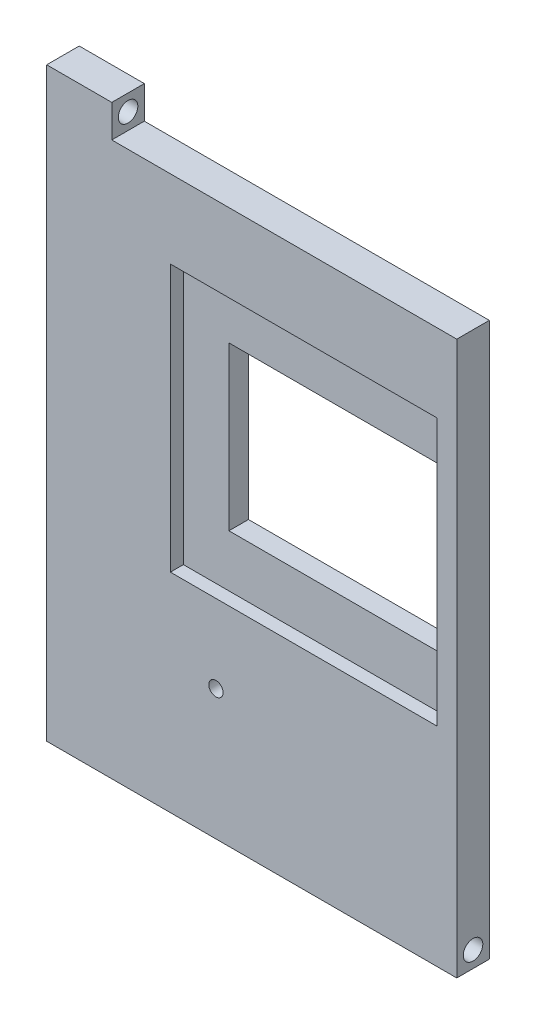
ISO-10303-21;
HEADER;
FILE_DESCRIPTION(('STEP AP214'),'2;1');
FILE_NAME('part.step','',(''),(''),'','','');
FILE_SCHEMA(('AUTOMOTIVE_DESIGN { 1 0 10303 214 1 1 1 1 }'));
ENDSEC;
DATA;
#1=APPLICATION_CONTEXT('core data for automotive mechanical design processes');
#2=APPLICATION_PROTOCOL_DEFINITION('international standard','automotive_design',2000,#1);
#3=PRODUCT_CONTEXT('',#1,'mechanical');
#4=PRODUCT('Part','Part','',(#3));
#5=PRODUCT_RELATED_PRODUCT_CATEGORY('part','',(#4));
#6=PRODUCT_DEFINITION_FORMATION('','',#4);
#7=PRODUCT_DEFINITION_CONTEXT('part definition',#1,'design');
#8=PRODUCT_DEFINITION('design','',#6,#7);
#9=PRODUCT_DEFINITION_SHAPE('','',#8);
#10=(LENGTH_UNIT() NAMED_UNIT(*) SI_UNIT(.MILLI.,.METRE.));
#11=(NAMED_UNIT(*) PLANE_ANGLE_UNIT() SI_UNIT($,.RADIAN.));
#12=(NAMED_UNIT(*) SI_UNIT($,.STERADIAN.) SOLID_ANGLE_UNIT());
#13=UNCERTAINTY_MEASURE_WITH_UNIT(LENGTH_MEASURE(1.E-05),#10,'distance_accuracy_value','');
#14=(GEOMETRIC_REPRESENTATION_CONTEXT(3) GLOBAL_UNCERTAINTY_ASSIGNED_CONTEXT((#13)) GLOBAL_UNIT_ASSIGNED_CONTEXT((#10,
#11,#12)) REPRESENTATION_CONTEXT('',''));
#15=CARTESIAN_POINT('',(0.,0.,0.));
#16=DIRECTION('',(0.,0.,1.));
#17=DIRECTION('',(1.,0.,0.));
#18=AXIS2_PLACEMENT_3D('',#15,#16,#17);
#19=CARTESIAN_POINT('',(0.,0.,5.));
#20=DIRECTION('',(0.,0.,-1.));
#21=DIRECTION('',(-1.,0.,0.));
#22=AXIS2_PLACEMENT_3D('',#19,#20,#21);
#23=PLANE('',#22);
#24=CARTESIAN_POINT('',(26.,20.,5.));
#25=DIRECTION('',(0.,0.,-1.));
#26=DIRECTION('',(-1.,0.,0.));
#27=AXIS2_PLACEMENT_3D('',#24,#25,#26);
#28=CIRCLE('',#27,1.1);
#29=CARTESIAN_POINT('',(24.9,20.,5.));
#30=VERTEX_POINT('',#29);
#31=EDGE_CURVE('E342',#30,#30,#28,.F.);
#32=ORIENTED_EDGE('',*,*,#31,.F.);
#33=EDGE_LOOP('',(#32));
#34=FACE_BOUND('',#33,.T.);
#35=DIRECTION('',(0.,-1.,0.));
#36=VECTOR('',#35,1.);
#37=CARTESIAN_POINT('',(0.,90.,5.));
#38=LINE('',#37,#36);
#39=CARTESIAN_POINT('',(0.,90.,5.));
#40=VERTEX_POINT('',#39);
#41=CARTESIAN_POINT('',(0.,0.,5.));
#42=VERTEX_POINT('',#41);
#43=EDGE_CURVE('E185',#40,#42,#38,.T.);
#44=ORIENTED_EDGE('',*,*,#43,.T.);
#45=DIRECTION('',(1.,0.,0.));
#46=VECTOR('',#45,1.);
#47=CARTESIAN_POINT('',(63.,0.,5.));
#48=LINE('',#47,#46);
#49=CARTESIAN_POINT('',(63.,0.,5.));
#50=VERTEX_POINT('',#49);
#51=EDGE_CURVE('E187',#42,#50,#48,.T.);
#52=ORIENTED_EDGE('',*,*,#51,.T.);
#53=DIRECTION('',(0.,1.,0.));
#54=VECTOR('',#53,1.);
#55=CARTESIAN_POINT('',(63.,0.,5.));
#56=LINE('',#55,#54);
#57=CARTESIAN_POINT('',(63.,85.,5.));
#58=VERTEX_POINT('',#57);
#59=EDGE_CURVE('E190',#50,#58,#56,.T.);
#60=ORIENTED_EDGE('',*,*,#59,.T.);
#61=DIRECTION('',(-1.,0.,0.));
#62=VECTOR('',#61,1.);
#63=CARTESIAN_POINT('',(63.,85.,5.));
#64=LINE('',#63,#62);
#65=CARTESIAN_POINT('',(9.99999999999999,85.,5.));
#66=VERTEX_POINT('',#65);
#67=EDGE_CURVE('E192',#58,#66,#64,.T.);
#68=ORIENTED_EDGE('',*,*,#67,.T.);
#69=DIRECTION('',(0.,1.,0.));
#70=VECTOR('',#69,1.);
#71=CARTESIAN_POINT('',(9.99999999999999,85.,5.));
#72=LINE('',#71,#70);
#73=CARTESIAN_POINT('',(9.99999999999999,90.,5.));
#74=VERTEX_POINT('',#73);
#75=EDGE_CURVE('E194',#66,#74,#72,.T.);
#76=ORIENTED_EDGE('',*,*,#75,.T.);
#77=DIRECTION('',(-1.,0.,0.));
#78=VECTOR('',#77,1.);
#79=CARTESIAN_POINT('',(9.99999999999999,90.,5.));
#80=LINE('',#79,#78);
#81=EDGE_CURVE('E196',#74,#40,#80,.T.);
#82=ORIENTED_EDGE('',*,*,#81,.T.);
#83=EDGE_LOOP('',(#44,#52,#60,#68,#76,#82));
#84=FACE_BOUND('',#83,.T.);
#85=DIRECTION('',(0.,1.,0.));
#86=VECTOR('',#85,1.);
#87=CARTESIAN_POINT('',(60.,65.,5.));
#88=LINE('',#87,#86);
#89=CARTESIAN_POINT('',(60.,32.,5.));
#90=VERTEX_POINT('',#89);
#91=CARTESIAN_POINT('',(60.,73.,5.));
#92=VERTEX_POINT('',#91);
#93=EDGE_CURVE('E166',#90,#92,#88,.T.);
#94=ORIENTED_EDGE('',*,*,#93,.F.);
#95=DIRECTION('',(-1.,0.,0.));
#96=VECTOR('',#95,1.);
#97=CARTESIAN_POINT('',(0.,32.,5.));
#98=LINE('',#97,#96);
#99=CARTESIAN_POINT('',(19.,32.,5.));
#100=VERTEX_POINT('',#99);
#101=EDGE_CURVE('E154',#90,#100,#98,.T.);
#102=ORIENTED_EDGE('',*,*,#101,.T.);
#103=DIRECTION('',(0.,1.,0.));
#104=VECTOR('',#103,1.);
#105=CARTESIAN_POINT('',(19.,0.,5.));
#106=LINE('',#105,#104);
#107=CARTESIAN_POINT('',(19.,73.,5.));
#108=VERTEX_POINT('',#107);
#109=EDGE_CURVE('E363',#100,#108,#106,.T.);
#110=ORIENTED_EDGE('',*,*,#109,.T.);
#111=DIRECTION('',(1.,0.,0.));
#112=VECTOR('',#111,1.);
#113=CARTESIAN_POINT('',(0.,73.,5.));
#114=LINE('',#113,#112);
#115=EDGE_CURVE('E141',#108,#92,#114,.T.);
#116=ORIENTED_EDGE('',*,*,#115,.T.);
#117=EDGE_LOOP('',(#94,#102,#110,#116));
#118=FACE_BOUND('',#117,.T.);
#119=ADVANCED_FACE('F37',(#34,#84,#118),#23,.F.);
#120=CARTESIAN_POINT('',(0.,0.,5.));
#121=DIRECTION('',(1.,0.,0.));
#122=DIRECTION('',(0.,0.,-1.));
#123=AXIS2_PLACEMENT_3D('',#120,#121,#122);
#124=PLANE('',#123);
#125=CARTESIAN_POINT('',(0.,87.5,2.5));
#126=DIRECTION('',(-1.,0.,0.));
#127=DIRECTION('',(0.,0.,1.));
#128=AXIS2_PLACEMENT_3D('',#125,#126,#127);
#129=CIRCLE('',#128,1.5);
#130=CARTESIAN_POINT('',(0.,87.5,4.));
#131=VERTEX_POINT('',#130);
#132=EDGE_CURVE('E351',#131,#131,#129,.T.);
#133=ORIENTED_EDGE('',*,*,#132,.F.);
#134=EDGE_LOOP('',(#133));
#135=FACE_BOUND('',#134,.T.);
#136=DIRECTION('',(0.,-1.,0.));
#137=VECTOR('',#136,1.);
#138=CARTESIAN_POINT('',(0.,0.,0.));
#139=LINE('',#138,#137);
#140=CARTESIAN_POINT('',(0.,90.,0.));
#141=VERTEX_POINT('',#140);
#142=CARTESIAN_POINT('',(0.,0.,0.));
#143=VERTEX_POINT('',#142);
#144=EDGE_CURVE('E168',#141,#143,#139,.T.);
#145=ORIENTED_EDGE('',*,*,#144,.T.);
#146=DIRECTION('',(0.,0.,-1.));
#147=VECTOR('',#146,1.);
#148=CARTESIAN_POINT('',(0.,0.,5.));
#149=LINE('',#148,#147);
#150=EDGE_CURVE('E45',#42,#143,#149,.T.);
#151=ORIENTED_EDGE('',*,*,#150,.F.);
#152=ORIENTED_EDGE('',*,*,#43,.F.);
#153=DIRECTION('',(0.,0.,-1.));
#154=VECTOR('',#153,1.);
#155=CARTESIAN_POINT('',(0.,90.,5.));
#156=LINE('',#155,#154);
#157=EDGE_CURVE('E198',#40,#141,#156,.T.);
#158=ORIENTED_EDGE('',*,*,#157,.T.);
#159=EDGE_LOOP('',(#145,#151,#152,#158));
#160=FACE_BOUND('',#159,.T.);
#161=ADVANCED_FACE('F39',(#135,#160),#124,.F.);
#162=CARTESIAN_POINT('',(63.,0.,5.));
#163=DIRECTION('',(0.,1.,0.));
#164=DIRECTION('',(-1.,0.,0.));
#165=AXIS2_PLACEMENT_3D('',#162,#163,#164);
#166=PLANE('',#165);
#167=DIRECTION('',(1.,0.,0.));
#168=VECTOR('',#167,1.);
#169=CARTESIAN_POINT('',(63.,0.,0.));
#170=LINE('',#169,#168);
#171=CARTESIAN_POINT('',(63.,0.,0.));
#172=VERTEX_POINT('',#171);
#173=EDGE_CURVE('E200',#143,#172,#170,.T.);
#174=ORIENTED_EDGE('',*,*,#173,.T.);
#175=DIRECTION('',(0.,0.,-1.));
#176=VECTOR('',#175,1.);
#177=CARTESIAN_POINT('',(63.,0.,5.));
#178=LINE('',#177,#176);
#179=EDGE_CURVE('E221',#50,#172,#178,.T.);
#180=ORIENTED_EDGE('',*,*,#179,.F.);
#181=ORIENTED_EDGE('',*,*,#51,.F.);
#182=ORIENTED_EDGE('',*,*,#150,.T.);
#183=EDGE_LOOP('',(#174,#180,#181,#182));
#184=FACE_BOUND('',#183,.T.);
#185=ADVANCED_FACE('F228',(#184),#166,.F.);
#186=CARTESIAN_POINT('',(63.,0.,5.));
#187=DIRECTION('',(-1.,0.,0.));
#188=DIRECTION('',(0.,-1.,0.));
#189=AXIS2_PLACEMENT_3D('',#186,#187,#188);
#190=PLANE('',#189);
#191=CARTESIAN_POINT('',(63.,2.50000000000001,2.5));
#192=DIRECTION('',(1.,0.,0.));
#193=DIRECTION('',(0.,0.,-1.));
#194=AXIS2_PLACEMENT_3D('',#191,#192,#193);
#195=CIRCLE('',#194,1.5);
#196=CARTESIAN_POINT('',(63.,2.50000000000001,1.));
#197=VERTEX_POINT('',#196);
#198=EDGE_CURVE('E343',#197,#197,#195,.T.);
#199=ORIENTED_EDGE('',*,*,#198,.F.);
#200=EDGE_LOOP('',(#199));
#201=FACE_BOUND('',#200,.T.);
#202=DIRECTION('',(0.,1.,0.));
#203=VECTOR('',#202,1.);
#204=CARTESIAN_POINT('',(63.,0.,0.));
#205=LINE('',#204,#203);
#206=CARTESIAN_POINT('',(63.,85.,0.));
#207=VERTEX_POINT('',#206);
#208=EDGE_CURVE('E202',#172,#207,#205,.T.);
#209=ORIENTED_EDGE('',*,*,#208,.T.);
#210=DIRECTION('',(0.,0.,-1.));
#211=VECTOR('',#210,1.);
#212=CARTESIAN_POINT('',(63.,85.,5.));
#213=LINE('',#212,#211);
#214=EDGE_CURVE('E218',#58,#207,#213,.T.);
#215=ORIENTED_EDGE('',*,*,#214,.F.);
#216=ORIENTED_EDGE('',*,*,#59,.F.);
#217=ORIENTED_EDGE('',*,*,#179,.T.);
#218=EDGE_LOOP('',(#209,#215,#216,#217));
#219=FACE_BOUND('',#218,.T.);
#220=ADVANCED_FACE('F240',(#201,#219),#190,.F.);
#221=CARTESIAN_POINT('',(63.,85.,5.));
#222=DIRECTION('',(0.,-1.,0.));
#223=DIRECTION('',(1.,0.,0.));
#224=AXIS2_PLACEMENT_3D('',#221,#222,#223);
#225=PLANE('',#224);
#226=DIRECTION('',(-1.,0.,0.));
#227=VECTOR('',#226,1.);
#228=CARTESIAN_POINT('',(63.,85.,0.));
#229=LINE('',#228,#227);
#230=CARTESIAN_POINT('',(9.99999999999999,85.,0.));
#231=VERTEX_POINT('',#230);
#232=EDGE_CURVE('E204',#207,#231,#229,.T.);
#233=ORIENTED_EDGE('',*,*,#232,.T.);
#234=DIRECTION('',(0.,0.,-1.));
#235=VECTOR('',#234,1.);
#236=CARTESIAN_POINT('',(9.99999999999999,85.,5.));
#237=LINE('',#236,#235);
#238=EDGE_CURVE('E215',#66,#231,#237,.T.);
#239=ORIENTED_EDGE('',*,*,#238,.F.);
#240=ORIENTED_EDGE('',*,*,#67,.F.);
#241=ORIENTED_EDGE('',*,*,#214,.T.);
#242=EDGE_LOOP('',(#233,#239,#240,#241));
#243=FACE_BOUND('',#242,.T.);
#244=ADVANCED_FACE('F244',(#243),#225,.F.);
#245=CARTESIAN_POINT('',(9.99999999999999,85.,5.));
#246=DIRECTION('',(-1.,0.,0.));
#247=DIRECTION('',(0.,0.,1.));
#248=AXIS2_PLACEMENT_3D('',#245,#246,#247);
#249=PLANE('',#248);
#250=CARTESIAN_POINT('',(9.99999999999999,87.5,2.5));
#251=DIRECTION('',(-1.,0.,0.));
#252=DIRECTION('',(0.,0.,1.));
#253=AXIS2_PLACEMENT_3D('',#250,#251,#252);
#254=CIRCLE('',#253,1.5);
#255=CARTESIAN_POINT('',(9.99999999999999,87.5,4.));
#256=VERTEX_POINT('',#255);
#257=EDGE_CURVE('E355',#256,#256,#254,.F.);
#258=ORIENTED_EDGE('',*,*,#257,.F.);
#259=EDGE_LOOP('',(#258));
#260=FACE_BOUND('',#259,.T.);
#261=DIRECTION('',(0.,1.,0.));
#262=VECTOR('',#261,1.);
#263=CARTESIAN_POINT('',(9.99999999999999,85.,0.));
#264=LINE('',#263,#262);
#265=CARTESIAN_POINT('',(9.99999999999999,90.,0.));
#266=VERTEX_POINT('',#265);
#267=EDGE_CURVE('E206',#231,#266,#264,.T.);
#268=ORIENTED_EDGE('',*,*,#267,.T.);
#269=DIRECTION('',(0.,0.,-1.));
#270=VECTOR('',#269,1.);
#271=CARTESIAN_POINT('',(9.99999999999999,90.,5.));
#272=LINE('',#271,#270);
#273=EDGE_CURVE('E212',#74,#266,#272,.T.);
#274=ORIENTED_EDGE('',*,*,#273,.F.);
#275=ORIENTED_EDGE('',*,*,#75,.F.);
#276=ORIENTED_EDGE('',*,*,#238,.T.);
#277=EDGE_LOOP('',(#268,#274,#275,#276));
#278=FACE_BOUND('',#277,.T.);
#279=ADVANCED_FACE('F255',(#260,#278),#249,.F.);
#280=CARTESIAN_POINT('',(9.99999999999999,90.,5.));
#281=DIRECTION('',(0.,-1.,0.));
#282=DIRECTION('',(0.,0.,-1.));
#283=AXIS2_PLACEMENT_3D('',#280,#281,#282);
#284=PLANE('',#283);
#285=DIRECTION('',(-1.,0.,0.));
#286=VECTOR('',#285,1.);
#287=CARTESIAN_POINT('',(9.99999999999999,90.,0.));
#288=LINE('',#287,#286);
#289=EDGE_CURVE('E188',#266,#141,#288,.T.);
#290=ORIENTED_EDGE('',*,*,#289,.T.);
#291=ORIENTED_EDGE('',*,*,#157,.F.);
#292=ORIENTED_EDGE('',*,*,#81,.F.);
#293=ORIENTED_EDGE('',*,*,#273,.T.);
#294=EDGE_LOOP('',(#290,#291,#292,#293));
#295=FACE_BOUND('',#294,.T.);
#296=ADVANCED_FACE('F253',(#295),#284,.F.);
#297=CARTESIAN_POINT('',(0.,0.,0.));
#298=DIRECTION('',(0.,0.,-1.));
#299=DIRECTION('',(-1.,0.,0.));
#300=AXIS2_PLACEMENT_3D('',#297,#298,#299);
#301=PLANE('',#300);
#302=CARTESIAN_POINT('',(26.,20.,0.));
#303=DIRECTION('',(0.,0.,-1.));
#304=DIRECTION('',(-1.,0.,0.));
#305=AXIS2_PLACEMENT_3D('',#302,#303,#304);
#306=CIRCLE('',#305,1.1);
#307=CARTESIAN_POINT('',(24.9,20.,0.));
#308=VERTEX_POINT('',#307);
#309=EDGE_CURVE('E286',#308,#308,#306,.T.);
#310=ORIENTED_EDGE('',*,*,#309,.F.);
#311=EDGE_LOOP('',(#310));
#312=FACE_BOUND('',#311,.T.);
#313=DIRECTION('',(0.,-1.,0.));
#314=VECTOR('',#313,1.);
#315=CARTESIAN_POINT('',(60.,65.,0.));
#316=LINE('',#315,#314);
#317=CARTESIAN_POINT('',(60.,65.,0.));
#318=VERTEX_POINT('',#317);
#319=CARTESIAN_POINT('',(60.,40.,0.));
#320=VERTEX_POINT('',#319);
#321=EDGE_CURVE('E165',#318,#320,#316,.T.);
#322=ORIENTED_EDGE('',*,*,#321,.F.);
#323=DIRECTION('',(-1.,0.,0.));
#324=VECTOR('',#323,1.);
#325=CARTESIAN_POINT('',(60.,65.,0.));
#326=LINE('',#325,#324);
#327=CARTESIAN_POINT('',(26.,65.,0.));
#328=VERTEX_POINT('',#327);
#329=EDGE_CURVE('E176',#318,#328,#326,.T.);
#330=ORIENTED_EDGE('',*,*,#329,.T.);
#331=DIRECTION('',(0.,-1.,0.));
#332=VECTOR('',#331,1.);
#333=CARTESIAN_POINT('',(26.,65.,0.));
#334=LINE('',#333,#332);
#335=CARTESIAN_POINT('',(26.,40.,0.));
#336=VERTEX_POINT('',#335);
#337=EDGE_CURVE('E173',#328,#336,#334,.T.);
#338=ORIENTED_EDGE('',*,*,#337,.T.);
#339=DIRECTION('',(-1.,0.,0.));
#340=VECTOR('',#339,1.);
#341=CARTESIAN_POINT('',(60.,40.,0.));
#342=LINE('',#341,#340);
#343=EDGE_CURVE('E171',#320,#336,#342,.T.);
#344=ORIENTED_EDGE('',*,*,#343,.F.);
#345=EDGE_LOOP('',(#322,#330,#338,#344));
#346=FACE_BOUND('',#345,.T.);
#347=ORIENTED_EDGE('',*,*,#144,.F.);
#348=ORIENTED_EDGE('',*,*,#289,.F.);
#349=ORIENTED_EDGE('',*,*,#267,.F.);
#350=ORIENTED_EDGE('',*,*,#232,.F.);
#351=ORIENTED_EDGE('',*,*,#208,.F.);
#352=ORIENTED_EDGE('',*,*,#173,.F.);
#353=EDGE_LOOP('',(#347,#348,#349,#350,#351,#352));
#354=FACE_BOUND('',#353,.T.);
#355=ADVANCED_FACE('F234',(#312,#346,#354),#301,.T.);
#356=CARTESIAN_POINT('',(60.,65.,47.2018956920184));
#357=DIRECTION('',(1.,0.,0.));
#358=DIRECTION('',(0.,0.,-1.));
#359=AXIS2_PLACEMENT_3D('',#356,#357,#358);
#360=PLANE('',#359);
#361=DIRECTION('',(0.,0.,-1.));
#362=VECTOR('',#361,1.);
#363=CARTESIAN_POINT('',(60.,40.,47.2018956920184));
#364=LINE('',#363,#362);
#365=CARTESIAN_POINT('',(60.,40.,3.));
#366=VERTEX_POINT('',#365);
#367=EDGE_CURVE('E58',#366,#320,#364,.T.);
#368=ORIENTED_EDGE('',*,*,#367,.F.);
#369=DIRECTION('',(0.,-1.,0.));
#370=VECTOR('',#369,1.);
#371=CARTESIAN_POINT('',(60.,0.,3.));
#372=LINE('',#371,#370);
#373=CARTESIAN_POINT('',(60.,32.,3.));
#374=VERTEX_POINT('',#373);
#375=EDGE_CURVE('E52',#366,#374,#372,.T.);
#376=ORIENTED_EDGE('',*,*,#375,.T.);
#377=DIRECTION('',(0.,0.,1.));
#378=VECTOR('',#377,1.);
#379=CARTESIAN_POINT('',(60.,32.,3.));
#380=LINE('',#379,#378);
#381=EDGE_CURVE('E139',#374,#90,#380,.T.);
#382=ORIENTED_EDGE('',*,*,#381,.T.);
#383=ORIENTED_EDGE('',*,*,#93,.T.);
#384=DIRECTION('',(0.,0.,1.));
#385=VECTOR('',#384,1.);
#386=CARTESIAN_POINT('',(60.,73.,3.));
#387=LINE('',#386,#385);
#388=CARTESIAN_POINT('',(60.,73.,3.));
#389=VERTEX_POINT('',#388);
#390=EDGE_CURVE('E361',#389,#92,#387,.T.);
#391=ORIENTED_EDGE('',*,*,#390,.F.);
#392=CARTESIAN_POINT('',(60.,65.,3.));
#393=VERTEX_POINT('',#392);
#394=EDGE_CURVE('E140',#389,#393,#372,.T.);
#395=ORIENTED_EDGE('',*,*,#394,.T.);
#396=DIRECTION('',(0.,0.,-1.));
#397=VECTOR('',#396,1.);
#398=CARTESIAN_POINT('',(60.,65.,47.2018956920184));
#399=LINE('',#398,#397);
#400=EDGE_CURVE('E169',#393,#318,#399,.T.);
#401=ORIENTED_EDGE('',*,*,#400,.T.);
#402=ORIENTED_EDGE('',*,*,#321,.T.);
#403=EDGE_LOOP('',(#368,#376,#382,#383,#391,#395,#401,#402));
#404=FACE_BOUND('',#403,.T.);
#405=ADVANCED_FACE('F137',(#404),#360,.F.);
#406=CARTESIAN_POINT('',(60.,65.,47.2018956920184));
#407=DIRECTION('',(0.,-1.,0.));
#408=DIRECTION('',(1.,0.,0.));
#409=AXIS2_PLACEMENT_3D('',#406,#407,#408);
#410=PLANE('',#409);
#411=DIRECTION('',(1.,0.,0.));
#412=VECTOR('',#411,1.);
#413=CARTESIAN_POINT('',(60.,65.,3.));
#414=LINE('',#413,#412);
#415=CARTESIAN_POINT('',(26.,65.,3.));
#416=VERTEX_POINT('',#415);
#417=EDGE_CURVE('E158',#416,#393,#414,.T.);
#418=ORIENTED_EDGE('',*,*,#417,.F.);
#419=DIRECTION('',(0.,0.,-1.));
#420=VECTOR('',#419,1.);
#421=CARTESIAN_POINT('',(26.,65.,47.2018956920184));
#422=LINE('',#421,#420);
#423=EDGE_CURVE('E180',#416,#328,#422,.T.);
#424=ORIENTED_EDGE('',*,*,#423,.T.);
#425=ORIENTED_EDGE('',*,*,#329,.F.);
#426=ORIENTED_EDGE('',*,*,#400,.F.);
#427=EDGE_LOOP('',(#418,#424,#425,#426));
#428=FACE_BOUND('',#427,.T.);
#429=ADVANCED_FACE('F282',(#428),#410,.T.);
#430=CARTESIAN_POINT('',(26.,65.,47.2018956920184));
#431=DIRECTION('',(1.,0.,0.));
#432=DIRECTION('',(0.,1.,0.));
#433=AXIS2_PLACEMENT_3D('',#430,#431,#432);
#434=PLANE('',#433);
#435=DIRECTION('',(0.,1.,0.));
#436=VECTOR('',#435,1.);
#437=CARTESIAN_POINT('',(26.,65.,3.));
#438=LINE('',#437,#436);
#439=CARTESIAN_POINT('',(26.,40.,3.));
#440=VERTEX_POINT('',#439);
#441=EDGE_CURVE('E155',#440,#416,#438,.T.);
#442=ORIENTED_EDGE('',*,*,#441,.F.);
#443=DIRECTION('',(0.,0.,-1.));
#444=VECTOR('',#443,1.);
#445=CARTESIAN_POINT('',(26.,40.,47.2018956920184));
#446=LINE('',#445,#444);
#447=EDGE_CURVE('E182',#440,#336,#446,.T.);
#448=ORIENTED_EDGE('',*,*,#447,.T.);
#449=ORIENTED_EDGE('',*,*,#337,.F.);
#450=ORIENTED_EDGE('',*,*,#423,.F.);
#451=EDGE_LOOP('',(#442,#448,#449,#450));
#452=FACE_BOUND('',#451,.T.);
#453=ADVANCED_FACE('F300',(#452),#434,.T.);
#454=CARTESIAN_POINT('',(60.,40.,47.2018956920184));
#455=DIRECTION('',(0.,-1.,0.));
#456=DIRECTION('',(0.,0.,-1.));
#457=AXIS2_PLACEMENT_3D('',#454,#455,#456);
#458=PLANE('',#457);
#459=ORIENTED_EDGE('',*,*,#447,.F.);
#460=DIRECTION('',(1.,0.,0.));
#461=VECTOR('',#460,1.);
#462=CARTESIAN_POINT('',(60.,40.,3.));
#463=LINE('',#462,#461);
#464=EDGE_CURVE('E11',#440,#366,#463,.T.);
#465=ORIENTED_EDGE('',*,*,#464,.T.);
#466=ORIENTED_EDGE('',*,*,#367,.T.);
#467=ORIENTED_EDGE('',*,*,#343,.T.);
#468=EDGE_LOOP('',(#459,#465,#466,#467));
#469=FACE_BOUND('',#468,.T.);
#470=ADVANCED_FACE('F302',(#469),#458,.F.);
#471=CARTESIAN_POINT('',(0.,32.,3.));
#472=DIRECTION('',(0.,1.,0.));
#473=DIRECTION('',(0.,0.,1.));
#474=AXIS2_PLACEMENT_3D('',#471,#472,#473);
#475=PLANE('',#474);
#476=ORIENTED_EDGE('',*,*,#101,.F.);
#477=ORIENTED_EDGE('',*,*,#381,.F.);
#478=DIRECTION('',(-1.,0.,0.));
#479=VECTOR('',#478,1.);
#480=CARTESIAN_POINT('',(0.,32.,3.));
#481=LINE('',#480,#479);
#482=CARTESIAN_POINT('',(19.,32.,3.));
#483=VERTEX_POINT('',#482);
#484=EDGE_CURVE('E144',#374,#483,#481,.T.);
#485=ORIENTED_EDGE('',*,*,#484,.T.);
#486=DIRECTION('',(0.,0.,1.));
#487=VECTOR('',#486,1.);
#488=CARTESIAN_POINT('',(19.,32.,3.));
#489=LINE('',#488,#487);
#490=EDGE_CURVE('E156',#483,#100,#489,.T.);
#491=ORIENTED_EDGE('',*,*,#490,.T.);
#492=EDGE_LOOP('',(#476,#477,#485,#491));
#493=FACE_BOUND('',#492,.T.);
#494=ADVANCED_FACE('F152',(#493),#475,.T.);
#495=CARTESIAN_POINT('',(19.,0.,3.));
#496=DIRECTION('',(1.,0.,0.));
#497=DIRECTION('',(0.,1.,0.));
#498=AXIS2_PLACEMENT_3D('',#495,#496,#497);
#499=PLANE('',#498);
#500=ORIENTED_EDGE('',*,*,#109,.F.);
#501=ORIENTED_EDGE('',*,*,#490,.F.);
#502=DIRECTION('',(0.,1.,0.));
#503=VECTOR('',#502,1.);
#504=CARTESIAN_POINT('',(19.,0.,3.));
#505=LINE('',#504,#503);
#506=CARTESIAN_POINT('',(19.,73.,3.));
#507=VERTEX_POINT('',#506);
#508=EDGE_CURVE('E147',#483,#507,#505,.T.);
#509=ORIENTED_EDGE('',*,*,#508,.T.);
#510=DIRECTION('',(0.,0.,1.));
#511=VECTOR('',#510,1.);
#512=CARTESIAN_POINT('',(19.,73.,3.));
#513=LINE('',#512,#511);
#514=EDGE_CURVE('E160',#507,#108,#513,.T.);
#515=ORIENTED_EDGE('',*,*,#514,.T.);
#516=EDGE_LOOP('',(#500,#501,#509,#515));
#517=FACE_BOUND('',#516,.T.);
#518=ADVANCED_FACE('F308',(#517),#499,.T.);
#519=CARTESIAN_POINT('',(0.,73.,3.));
#520=DIRECTION('',(0.,-1.,0.));
#521=DIRECTION('',(1.,0.,0.));
#522=AXIS2_PLACEMENT_3D('',#519,#520,#521);
#523=PLANE('',#522);
#524=ORIENTED_EDGE('',*,*,#115,.F.);
#525=ORIENTED_EDGE('',*,*,#514,.F.);
#526=DIRECTION('',(1.,0.,0.));
#527=VECTOR('',#526,1.);
#528=CARTESIAN_POINT('',(0.,73.,3.));
#529=LINE('',#528,#527);
#530=EDGE_CURVE('E359',#507,#389,#529,.T.);
#531=ORIENTED_EDGE('',*,*,#530,.T.);
#532=ORIENTED_EDGE('',*,*,#390,.T.);
#533=EDGE_LOOP('',(#524,#525,#531,#532));
#534=FACE_BOUND('',#533,.T.);
#535=ADVANCED_FACE('F316',(#534),#523,.T.);
#536=CARTESIAN_POINT('',(0.,0.,3.));
#537=DIRECTION('',(0.,0.,-1.));
#538=DIRECTION('',(-1.,0.,0.));
#539=AXIS2_PLACEMENT_3D('',#536,#537,#538);
#540=PLANE('',#539);
#541=ORIENTED_EDGE('',*,*,#417,.T.);
#542=ORIENTED_EDGE('',*,*,#394,.F.);
#543=ORIENTED_EDGE('',*,*,#530,.F.);
#544=ORIENTED_EDGE('',*,*,#508,.F.);
#545=ORIENTED_EDGE('',*,*,#484,.F.);
#546=ORIENTED_EDGE('',*,*,#375,.F.);
#547=ORIENTED_EDGE('',*,*,#464,.F.);
#548=ORIENTED_EDGE('',*,*,#441,.T.);
#549=EDGE_LOOP('',(#541,#542,#543,#544,#545,#546,#547,#548));
#550=FACE_BOUND('',#549,.T.);
#551=ADVANCED_FACE('F145',(#550),#540,.F.);
#552=CARTESIAN_POINT('',(63.001,87.5,2.5));
#553=DIRECTION('',(-1.,0.,0.));
#554=DIRECTION('',(0.,0.,1.));
#555=AXIS2_PLACEMENT_3D('',#552,#553,#554);
#556=CYLINDRICAL_SURFACE('',#555,1.5);
#557=ORIENTED_EDGE('',*,*,#132,.T.);
#558=EDGE_LOOP('',(#557));
#559=FACE_BOUND('',#558,.T.);
#560=ORIENTED_EDGE('',*,*,#257,.T.);
#561=EDGE_LOOP('',(#560));
#562=FACE_BOUND('',#561,.T.);
#563=ADVANCED_FACE('F323',(#559,#562),#556,.F.);
#564=CARTESIAN_POINT('',(48.,2.50000000000001,2.5));
#565=DIRECTION('',(1.,0.,0.));
#566=DIRECTION('',(0.,0.,-1.));
#567=AXIS2_PLACEMENT_3D('',#564,#565,#566);
#568=CYLINDRICAL_SURFACE('',#567,1.5);
#569=CARTESIAN_POINT('',(48.,2.50000000000001,2.5));
#570=DIRECTION('',(1.,0.,0.));
#571=DIRECTION('',(0.,0.,-1.));
#572=AXIS2_PLACEMENT_3D('',#569,#570,#571);
#573=CIRCLE('',#572,1.5);
#574=CARTESIAN_POINT('',(48.,2.50000000000001,1.));
#575=VERTEX_POINT('',#574);
#576=EDGE_CURVE('E346',#575,#575,#573,.T.);
#577=ORIENTED_EDGE('',*,*,#576,.F.);
#578=EDGE_LOOP('',(#577));
#579=FACE_BOUND('',#578,.T.);
#580=ORIENTED_EDGE('',*,*,#198,.T.);
#581=EDGE_LOOP('',(#580));
#582=FACE_BOUND('',#581,.T.);
#583=ADVANCED_FACE('F326',(#579,#582),#568,.F.);
#584=CARTESIAN_POINT('',(48.,2.50000000000001,2.5));
#585=DIRECTION('',(1.,0.,0.));
#586=DIRECTION('',(0.,0.,-1.));
#587=AXIS2_PLACEMENT_3D('',#584,#585,#586);
#588=PLANE('',#587);
#589=ORIENTED_EDGE('',*,*,#576,.T.);
#590=EDGE_LOOP('',(#589));
#591=FACE_BOUND('',#590,.T.);
#592=ADVANCED_FACE('F330',(#591),#588,.T.);
#593=CARTESIAN_POINT('',(26.,20.,5.001));
#594=DIRECTION('',(0.,0.,-1.));
#595=DIRECTION('',(-1.,0.,0.));
#596=AXIS2_PLACEMENT_3D('',#593,#594,#595);
#597=CYLINDRICAL_SURFACE('',#596,1.1);
#598=ORIENTED_EDGE('',*,*,#309,.T.);
#599=EDGE_LOOP('',(#598));
#600=FACE_BOUND('',#599,.T.);
#601=ORIENTED_EDGE('',*,*,#31,.T.);
#602=EDGE_LOOP('',(#601));
#603=FACE_BOUND('',#602,.T.);
#604=ADVANCED_FACE('F334',(#600,#603),#597,.F.);
#605=CLOSED_SHELL('',(#119,#161,#185,#220,#244,#279,#296,#355,#405,#429,#453,#470,#494,#518,
#535,#551,#563,#583,#592,#604));
#606=MANIFOLD_SOLID_BREP('B2',#605);
#607=ADVANCED_BREP_SHAPE_REPRESENTATION('',(#18,#606),#14);
#608=SHAPE_DEFINITION_REPRESENTATION(#9,#607);
ENDSEC;
END-ISO-10303-21;
